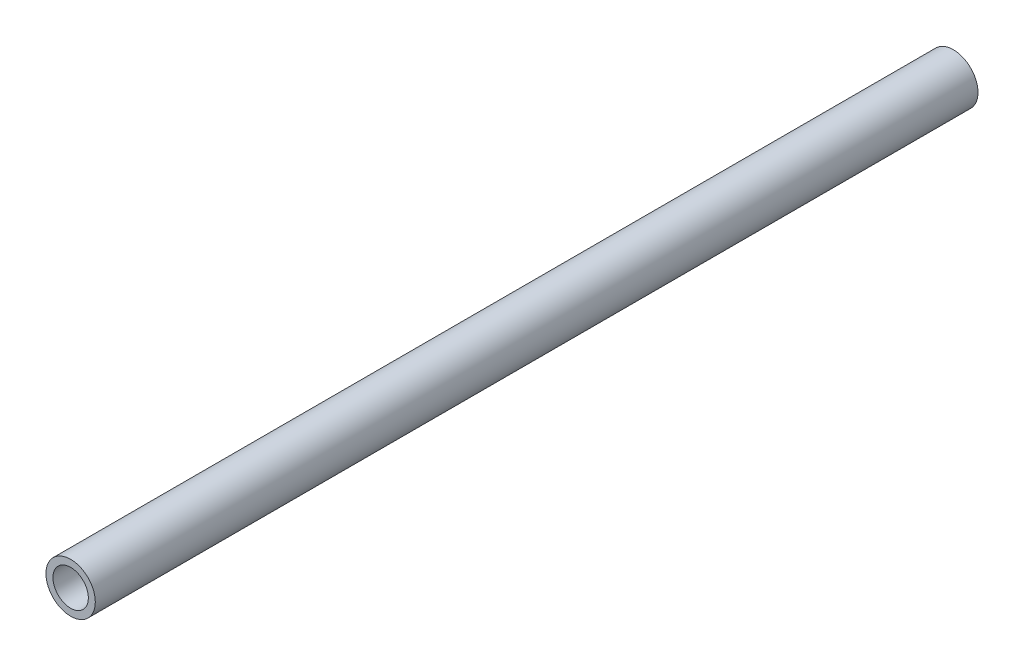
ISO-10303-21;
HEADER;
FILE_DESCRIPTION(('STEP AP214'),'2;1');
FILE_NAME('part.step','',(''),(''),'','','');
FILE_SCHEMA(('AUTOMOTIVE_DESIGN { 1 0 10303 214 1 1 1 1 }'));
ENDSEC;
DATA;
#1=APPLICATION_CONTEXT('core data for automotive mechanical design processes');
#2=APPLICATION_PROTOCOL_DEFINITION('international standard','automotive_design',2000,#1);
#3=PRODUCT_CONTEXT('',#1,'mechanical');
#4=PRODUCT('Part','Part','',(#3));
#5=PRODUCT_RELATED_PRODUCT_CATEGORY('part','',(#4));
#6=PRODUCT_DEFINITION_FORMATION('','',#4);
#7=PRODUCT_DEFINITION_CONTEXT('part definition',#1,'design');
#8=PRODUCT_DEFINITION('design','',#6,#7);
#9=PRODUCT_DEFINITION_SHAPE('','',#8);
#10=(LENGTH_UNIT() NAMED_UNIT(*) SI_UNIT(.MILLI.,.METRE.));
#11=(NAMED_UNIT(*) PLANE_ANGLE_UNIT() SI_UNIT($,.RADIAN.));
#12=(NAMED_UNIT(*) SI_UNIT($,.STERADIAN.) SOLID_ANGLE_UNIT());
#13=UNCERTAINTY_MEASURE_WITH_UNIT(LENGTH_MEASURE(1.E-05),#10,'distance_accuracy_value','');
#14=(GEOMETRIC_REPRESENTATION_CONTEXT(3) GLOBAL_UNCERTAINTY_ASSIGNED_CONTEXT((#13)) GLOBAL_UNIT_ASSIGNED_CONTEXT((#10,
#11,#12)) REPRESENTATION_CONTEXT('',''));
#15=CARTESIAN_POINT('',(0.,0.,0.));
#16=DIRECTION('',(0.,0.,1.));
#17=DIRECTION('',(1.,0.,0.));
#18=AXIS2_PLACEMENT_3D('',#15,#16,#17);
#19=CARTESIAN_POINT('',(0.,0.,152.));
#20=DIRECTION('',(0.,0.,1.));
#21=DIRECTION('',(1.,0.,0.));
#22=AXIS2_PLACEMENT_3D('',#19,#20,#21);
#23=PLANE('',#22);
#24=CARTESIAN_POINT('',(0.,0.,152.));
#25=DIRECTION('',(0.,0.,1.));
#26=DIRECTION('',(1.,0.,0.));
#27=AXIS2_PLACEMENT_3D('',#24,#25,#26);
#28=CIRCLE('',#27,4.25);
#29=CARTESIAN_POINT('',(4.25,0.,152.));
#30=VERTEX_POINT('',#29);
#31=EDGE_CURVE('E10',#30,#30,#28,.T.);
#32=ORIENTED_EDGE('',*,*,#31,.T.);
#33=EDGE_LOOP('',(#32));
#34=FACE_BOUND('',#33,.T.);
#35=CARTESIAN_POINT('',(0.,0.,152.));
#36=DIRECTION('',(0.,0.,1.));
#37=DIRECTION('',(1.,0.,0.));
#38=AXIS2_PLACEMENT_3D('',#35,#36,#37);
#39=CIRCLE('',#38,3.05);
#40=CARTESIAN_POINT('',(3.05,0.,152.));
#41=VERTEX_POINT('',#40);
#42=EDGE_CURVE('E46',#41,#41,#39,.T.);
#43=ORIENTED_EDGE('',*,*,#42,.F.);
#44=EDGE_LOOP('',(#43));
#45=FACE_BOUND('',#44,.T.);
#46=ADVANCED_FACE('F35',(#34,#45),#23,.T.);
#47=CARTESIAN_POINT('',(0.,0.,0.));
#48=DIRECTION('',(0.,0.,1.));
#49=DIRECTION('',(1.,0.,0.));
#50=AXIS2_PLACEMENT_3D('',#47,#48,#49);
#51=PLANE('',#50);
#52=CARTESIAN_POINT('',(0.,0.,0.));
#53=DIRECTION('',(0.,0.,1.));
#54=DIRECTION('',(1.,0.,0.));
#55=AXIS2_PLACEMENT_3D('',#52,#53,#54);
#56=CIRCLE('',#55,4.25);
#57=CARTESIAN_POINT('',(4.25,0.,0.));
#58=VERTEX_POINT('',#57);
#59=EDGE_CURVE('E39',#58,#58,#56,.T.);
#60=ORIENTED_EDGE('',*,*,#59,.F.);
#61=EDGE_LOOP('',(#60));
#62=FACE_BOUND('',#61,.T.);
#63=CARTESIAN_POINT('',(0.,0.,0.));
#64=DIRECTION('',(0.,0.,1.));
#65=DIRECTION('',(1.,0.,0.));
#66=AXIS2_PLACEMENT_3D('',#63,#64,#65);
#67=CIRCLE('',#66,3.05);
#68=CARTESIAN_POINT('',(3.05,0.,0.));
#69=VERTEX_POINT('',#68);
#70=EDGE_CURVE('E48',#69,#69,#67,.T.);
#71=ORIENTED_EDGE('',*,*,#70,.T.);
#72=EDGE_LOOP('',(#71));
#73=FACE_BOUND('',#72,.T.);
#74=ADVANCED_FACE('F58',(#62,#73),#51,.F.);
#75=CARTESIAN_POINT('',(0.,0.,152.));
#76=DIRECTION('',(0.,0.,-1.));
#77=DIRECTION('',(-1.,0.,0.));
#78=AXIS2_PLACEMENT_3D('',#75,#76,#77);
#79=CYLINDRICAL_SURFACE('',#78,4.25);
#80=ORIENTED_EDGE('',*,*,#31,.F.);
#81=EDGE_LOOP('',(#80));
#82=FACE_BOUND('',#81,.T.);
#83=ORIENTED_EDGE('',*,*,#59,.T.);
#84=EDGE_LOOP('',(#83));
#85=FACE_BOUND('',#84,.T.);
#86=ADVANCED_FACE('F37',(#82,#85),#79,.T.);
#87=CARTESIAN_POINT('',(0.,0.,152.));
#88=DIRECTION('',(0.,0.,-1.));
#89=DIRECTION('',(-1.,0.,0.));
#90=AXIS2_PLACEMENT_3D('',#87,#88,#89);
#91=CYLINDRICAL_SURFACE('',#90,3.05);
#92=ORIENTED_EDGE('',*,*,#42,.T.);
#93=EDGE_LOOP('',(#92));
#94=FACE_BOUND('',#93,.T.);
#95=ORIENTED_EDGE('',*,*,#70,.F.);
#96=EDGE_LOOP('',(#95));
#97=FACE_BOUND('',#96,.T.);
#98=ADVANCED_FACE('F54',(#94,#97),#91,.F.);
#99=CLOSED_SHELL('',(#46,#74,#86,#98));
#100=MANIFOLD_SOLID_BREP('B2',#99);
#101=ADVANCED_BREP_SHAPE_REPRESENTATION('',(#18,#100),#14);
#102=SHAPE_DEFINITION_REPRESENTATION(#9,#101);
ENDSEC;
END-ISO-10303-21;
